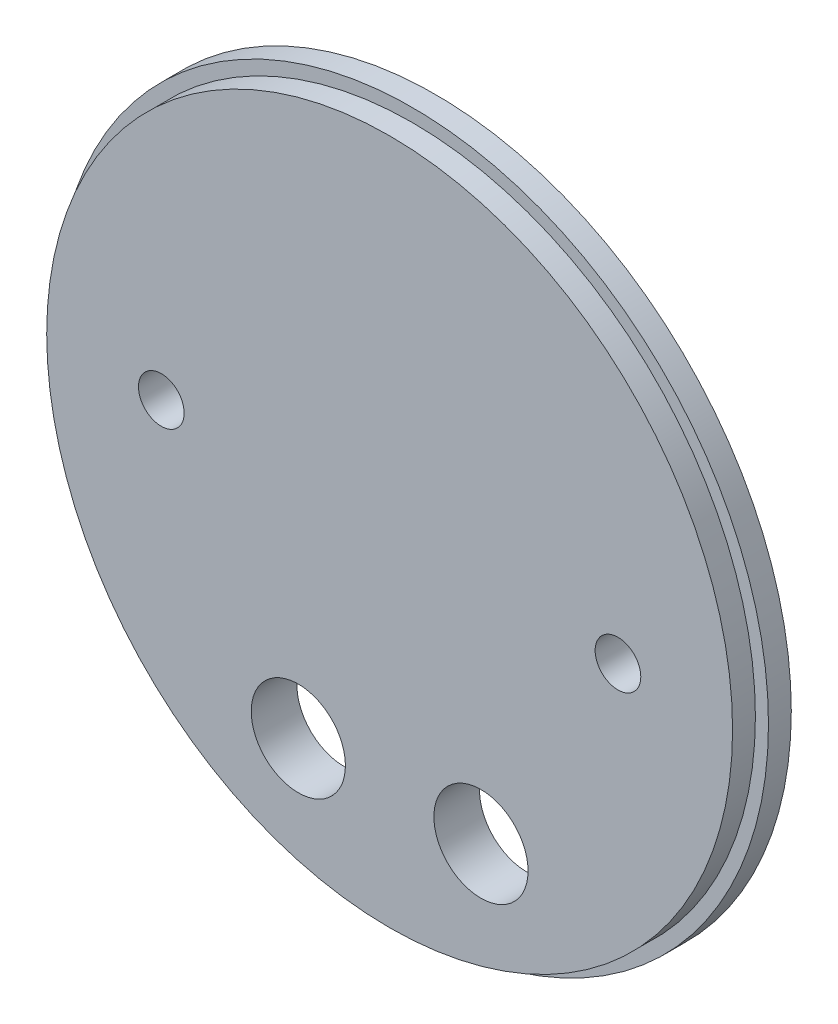
ISO-10303-21;
HEADER;
FILE_DESCRIPTION(('STEP AP214'),'2;1');
FILE_NAME('part.step','',(''),(''),'','','');
FILE_SCHEMA(('AUTOMOTIVE_DESIGN { 1 0 10303 214 1 1 1 1 }'));
ENDSEC;
DATA;
#1=APPLICATION_CONTEXT('core data for automotive mechanical design processes');
#2=APPLICATION_PROTOCOL_DEFINITION('international standard','automotive_design',2000,#1);
#3=PRODUCT_CONTEXT('',#1,'mechanical');
#4=PRODUCT('Part','Part','',(#3));
#5=PRODUCT_RELATED_PRODUCT_CATEGORY('part','',(#4));
#6=PRODUCT_DEFINITION_FORMATION('','',#4);
#7=PRODUCT_DEFINITION_CONTEXT('part definition',#1,'design');
#8=PRODUCT_DEFINITION('design','',#6,#7);
#9=PRODUCT_DEFINITION_SHAPE('','',#8);
#10=(LENGTH_UNIT() NAMED_UNIT(*) SI_UNIT(.MILLI.,.METRE.));
#11=(NAMED_UNIT(*) PLANE_ANGLE_UNIT() SI_UNIT($,.RADIAN.));
#12=(NAMED_UNIT(*) SI_UNIT($,.STERADIAN.) SOLID_ANGLE_UNIT());
#13=UNCERTAINTY_MEASURE_WITH_UNIT(LENGTH_MEASURE(1.E-05),#10,'distance_accuracy_value','');
#14=(GEOMETRIC_REPRESENTATION_CONTEXT(3) GLOBAL_UNCERTAINTY_ASSIGNED_CONTEXT((#13)) GLOBAL_UNIT_ASSIGNED_CONTEXT((#10,
#11,#12)) REPRESENTATION_CONTEXT('',''));
#15=CARTESIAN_POINT('',(0.,0.,0.));
#16=DIRECTION('',(0.,0.,1.));
#17=DIRECTION('',(1.,0.,0.));
#18=AXIS2_PLACEMENT_3D('',#15,#16,#17);
#19=CARTESIAN_POINT('',(0.,0.,3.175));
#20=DIRECTION('',(0.,0.,-1.));
#21=DIRECTION('',(-1.,0.,0.));
#22=AXIS2_PLACEMENT_3D('',#19,#20,#21);
#23=CYLINDRICAL_SURFACE('',#22,49.5046);
#24=CARTESIAN_POINT('',(0.,0.,3.175));
#25=DIRECTION('',(0.,0.,1.));
#26=DIRECTION('',(1.,0.,0.));
#27=AXIS2_PLACEMENT_3D('',#24,#25,#26);
#28=CIRCLE('',#27,49.5046);
#29=CARTESIAN_POINT('',(49.5046,0.,3.175));
#30=VERTEX_POINT('',#29);
#31=EDGE_CURVE('E42',#30,#30,#28,.T.);
#32=ORIENTED_EDGE('',*,*,#31,.F.);
#33=EDGE_LOOP('',(#32));
#34=FACE_BOUND('',#33,.T.);
#35=CARTESIAN_POINT('',(0.,0.,0.));
#36=DIRECTION('',(0.,0.,1.));
#37=DIRECTION('',(1.,0.,0.));
#38=AXIS2_PLACEMENT_3D('',#35,#36,#37);
#39=CIRCLE('',#38,49.5046);
#40=CARTESIAN_POINT('',(49.5046,0.,0.));
#41=VERTEX_POINT('',#40);
#42=EDGE_CURVE('E38',#41,#41,#39,.T.);
#43=ORIENTED_EDGE('',*,*,#42,.T.);
#44=EDGE_LOOP('',(#43));
#45=FACE_BOUND('',#44,.T.);
#46=ADVANCED_FACE('F35',(#34,#45),#23,.T.);
#47=CARTESIAN_POINT('',(0.,0.,3.175));
#48=DIRECTION('',(0.,0.,1.));
#49=DIRECTION('',(1.,0.,0.));
#50=AXIS2_PLACEMENT_3D('',#47,#48,#49);
#51=PLANE('',#50);
#52=CARTESIAN_POINT('',(0.,0.,3.175));
#53=DIRECTION('',(0.,0.,1.));
#54=DIRECTION('',(1.,0.,0.));
#55=AXIS2_PLACEMENT_3D('',#52,#53,#54);
#56=CIRCLE('',#55,47.6885);
#57=CARTESIAN_POINT('',(47.6885,0.,3.175));
#58=VERTEX_POINT('',#57);
#59=EDGE_CURVE('E10',#58,#58,#56,.T.);
#60=ORIENTED_EDGE('',*,*,#59,.F.);
#61=EDGE_LOOP('',(#60));
#62=FACE_BOUND('',#61,.T.);
#63=ORIENTED_EDGE('',*,*,#31,.T.);
#64=EDGE_LOOP('',(#63));
#65=FACE_BOUND('',#64,.T.);
#66=ADVANCED_FACE('F102',(#62,#65),#51,.T.);
#67=CARTESIAN_POINT('',(0.,0.,0.));
#68=DIRECTION('',(0.,0.,1.));
#69=DIRECTION('',(1.,0.,0.));
#70=AXIS2_PLACEMENT_3D('',#67,#68,#69);
#71=PLANE('',#70);
#72=CARTESIAN_POINT('',(31.75,0.,0.));
#73=DIRECTION('',(0.,0.,1.));
#74=DIRECTION('',(1.,0.,0.));
#75=AXIS2_PLACEMENT_3D('',#72,#73,#74);
#76=CIRCLE('',#75,3.175);
#77=CARTESIAN_POINT('',(34.925,0.,0.));
#78=VERTEX_POINT('',#77);
#79=EDGE_CURVE('E61',#78,#78,#76,.T.);
#80=ORIENTED_EDGE('',*,*,#79,.T.);
#81=EDGE_LOOP('',(#80));
#82=FACE_BOUND('',#81,.T.);
#83=CARTESIAN_POINT('',(-31.75,0.,0.));
#84=DIRECTION('',(0.,0.,1.));
#85=DIRECTION('',(1.,0.,0.));
#86=AXIS2_PLACEMENT_3D('',#83,#84,#85);
#87=CIRCLE('',#86,3.175);
#88=CARTESIAN_POINT('',(-28.575,0.,0.));
#89=VERTEX_POINT('',#88);
#90=EDGE_CURVE('E67',#89,#89,#87,.T.);
#91=ORIENTED_EDGE('',*,*,#90,.T.);
#92=EDGE_LOOP('',(#91));
#93=FACE_BOUND('',#92,.T.);
#94=CARTESIAN_POINT('',(12.7,-31.2353524431853,0.));
#95=DIRECTION('',(0.,0.,1.));
#96=DIRECTION('',(1.,0.,0.));
#97=AXIS2_PLACEMENT_3D('',#94,#95,#96);
#98=CIRCLE('',#97,6.5484375);
#99=CARTESIAN_POINT('',(19.2484375,-31.2353524431853,0.));
#100=VERTEX_POINT('',#99);
#101=EDGE_CURVE('E55',#100,#100,#98,.T.);
#102=ORIENTED_EDGE('',*,*,#101,.T.);
#103=EDGE_LOOP('',(#102));
#104=FACE_BOUND('',#103,.T.);
#105=CARTESIAN_POINT('',(-12.7,-31.2353524431853,0.));
#106=DIRECTION('',(0.,0.,1.));
#107=DIRECTION('',(1.,0.,0.));
#108=AXIS2_PLACEMENT_3D('',#105,#106,#107);
#109=CIRCLE('',#108,6.5484375);
#110=CARTESIAN_POINT('',(-6.1515625,-31.2353524431853,0.));
#111=VERTEX_POINT('',#110);
#112=EDGE_CURVE('E51',#111,#111,#109,.T.);
#113=ORIENTED_EDGE('',*,*,#112,.T.);
#114=EDGE_LOOP('',(#113));
#115=FACE_BOUND('',#114,.T.);
#116=ORIENTED_EDGE('',*,*,#42,.F.);
#117=EDGE_LOOP('',(#116));
#118=FACE_BOUND('',#117,.T.);
#119=ADVANCED_FACE('F76',(#82,#93,#104,#115,#118),#71,.F.);
#120=CARTESIAN_POINT('',(0.,0.,6.35));
#121=DIRECTION('',(0.,0.,-1.));
#122=DIRECTION('',(-1.,0.,0.));
#123=AXIS2_PLACEMENT_3D('',#120,#121,#122);
#124=CYLINDRICAL_SURFACE('',#123,47.6885);
#125=CARTESIAN_POINT('',(0.,0.,6.35));
#126=DIRECTION('',(0.,0.,1.));
#127=DIRECTION('',(1.,0.,0.));
#128=AXIS2_PLACEMENT_3D('',#125,#126,#127);
#129=CIRCLE('',#128,47.6885);
#130=CARTESIAN_POINT('',(47.6885,0.,6.35));
#131=VERTEX_POINT('',#130);
#132=EDGE_CURVE('E48',#131,#131,#129,.T.);
#133=ORIENTED_EDGE('',*,*,#132,.F.);
#134=EDGE_LOOP('',(#133));
#135=FACE_BOUND('',#134,.T.);
#136=ORIENTED_EDGE('',*,*,#59,.T.);
#137=EDGE_LOOP('',(#136));
#138=FACE_BOUND('',#137,.T.);
#139=ADVANCED_FACE('F90',(#135,#138),#124,.T.);
#140=CARTESIAN_POINT('',(0.,0.,6.35));
#141=DIRECTION('',(0.,0.,1.));
#142=DIRECTION('',(1.,0.,0.));
#143=AXIS2_PLACEMENT_3D('',#140,#141,#142);
#144=PLANE('',#143);
#145=CARTESIAN_POINT('',(31.75,0.,6.35));
#146=DIRECTION('',(0.,0.,1.));
#147=DIRECTION('',(1.,0.,0.));
#148=AXIS2_PLACEMENT_3D('',#145,#146,#147);
#149=CIRCLE('',#148,3.175);
#150=CARTESIAN_POINT('',(34.925,0.,6.35));
#151=VERTEX_POINT('',#150);
#152=EDGE_CURVE('E58',#151,#151,#149,.T.);
#153=ORIENTED_EDGE('',*,*,#152,.F.);
#154=EDGE_LOOP('',(#153));
#155=FACE_BOUND('',#154,.T.);
#156=CARTESIAN_POINT('',(-31.75,0.,6.35));
#157=DIRECTION('',(0.,0.,1.));
#158=DIRECTION('',(1.,0.,0.));
#159=AXIS2_PLACEMENT_3D('',#156,#157,#158);
#160=CIRCLE('',#159,3.175);
#161=CARTESIAN_POINT('',(-28.575,0.,6.35));
#162=VERTEX_POINT('',#161);
#163=EDGE_CURVE('E64',#162,#162,#160,.T.);
#164=ORIENTED_EDGE('',*,*,#163,.F.);
#165=EDGE_LOOP('',(#164));
#166=FACE_BOUND('',#165,.T.);
#167=CARTESIAN_POINT('',(12.7,-31.2353524431853,6.35));
#168=DIRECTION('',(0.,0.,1.));
#169=DIRECTION('',(1.,0.,0.));
#170=AXIS2_PLACEMENT_3D('',#167,#168,#169);
#171=CIRCLE('',#170,6.5484375);
#172=CARTESIAN_POINT('',(19.2484375,-31.2353524431853,6.35));
#173=VERTEX_POINT('',#172);
#174=EDGE_CURVE('E70',#173,#173,#171,.T.);
#175=ORIENTED_EDGE('',*,*,#174,.F.);
#176=EDGE_LOOP('',(#175));
#177=FACE_BOUND('',#176,.T.);
#178=CARTESIAN_POINT('',(-12.7,-31.2353524431853,6.35));
#179=DIRECTION('',(0.,0.,1.));
#180=DIRECTION('',(1.,0.,0.));
#181=AXIS2_PLACEMENT_3D('',#178,#179,#180);
#182=CIRCLE('',#181,6.5484375);
#183=CARTESIAN_POINT('',(-6.1515625,-31.2353524431853,6.35));
#184=VERTEX_POINT('',#183);
#185=EDGE_CURVE('E52',#184,#184,#182,.T.);
#186=ORIENTED_EDGE('',*,*,#185,.F.);
#187=EDGE_LOOP('',(#186));
#188=FACE_BOUND('',#187,.T.);
#189=ORIENTED_EDGE('',*,*,#132,.T.);
#190=EDGE_LOOP('',(#189));
#191=FACE_BOUND('',#190,.T.);
#192=ADVANCED_FACE('F87',(#155,#166,#177,#188,#191),#144,.T.);
#193=CARTESIAN_POINT('',(-12.7,-31.2353524431853,0.));
#194=DIRECTION('',(0.,0.,1.));
#195=DIRECTION('',(1.,0.,0.));
#196=AXIS2_PLACEMENT_3D('',#193,#194,#195);
#197=CYLINDRICAL_SURFACE('',#196,6.5484375);
#198=ORIENTED_EDGE('',*,*,#112,.F.);
#199=EDGE_LOOP('',(#198));
#200=FACE_BOUND('',#199,.T.);
#201=ORIENTED_EDGE('',*,*,#185,.T.);
#202=EDGE_LOOP('',(#201));
#203=FACE_BOUND('',#202,.T.);
#204=ADVANCED_FACE('F83',(#200,#203),#197,.F.);
#205=CARTESIAN_POINT('',(12.7,-31.2353524431853,0.));
#206=DIRECTION('',(0.,0.,1.));
#207=DIRECTION('',(1.,0.,0.));
#208=AXIS2_PLACEMENT_3D('',#205,#206,#207);
#209=CYLINDRICAL_SURFACE('',#208,6.5484375);
#210=ORIENTED_EDGE('',*,*,#101,.F.);
#211=EDGE_LOOP('',(#210));
#212=FACE_BOUND('',#211,.T.);
#213=ORIENTED_EDGE('',*,*,#174,.T.);
#214=EDGE_LOOP('',(#213));
#215=FACE_BOUND('',#214,.T.);
#216=ADVANCED_FACE('F79',(#212,#215),#209,.F.);
#217=CARTESIAN_POINT('',(-31.75,0.,0.));
#218=DIRECTION('',(0.,0.,1.));
#219=DIRECTION('',(1.,0.,0.));
#220=AXIS2_PLACEMENT_3D('',#217,#218,#219);
#221=CYLINDRICAL_SURFACE('',#220,3.175);
#222=ORIENTED_EDGE('',*,*,#90,.F.);
#223=EDGE_LOOP('',(#222));
#224=FACE_BOUND('',#223,.T.);
#225=ORIENTED_EDGE('',*,*,#163,.T.);
#226=EDGE_LOOP('',(#225));
#227=FACE_BOUND('',#226,.T.);
#228=ADVANCED_FACE('F82',(#224,#227),#221,.F.);
#229=CARTESIAN_POINT('',(31.75,0.,0.));
#230=DIRECTION('',(0.,0.,1.));
#231=DIRECTION('',(1.,0.,0.));
#232=AXIS2_PLACEMENT_3D('',#229,#230,#231);
#233=CYLINDRICAL_SURFACE('',#232,3.175);
#234=ORIENTED_EDGE('',*,*,#79,.F.);
#235=EDGE_LOOP('',(#234));
#236=FACE_BOUND('',#235,.T.);
#237=ORIENTED_EDGE('',*,*,#152,.T.);
#238=EDGE_LOOP('',(#237));
#239=FACE_BOUND('',#238,.T.);
#240=ADVANCED_FACE('F155',(#236,#239),#233,.F.);
#241=CLOSED_SHELL('',(#46,#66,#119,#139,#192,#204,#216,#228,#240));
#242=MANIFOLD_SOLID_BREP('B2',#241);
#243=ADVANCED_BREP_SHAPE_REPRESENTATION('',(#18,#242),#14);
#244=SHAPE_DEFINITION_REPRESENTATION(#9,#243);
ENDSEC;
END-ISO-10303-21;
